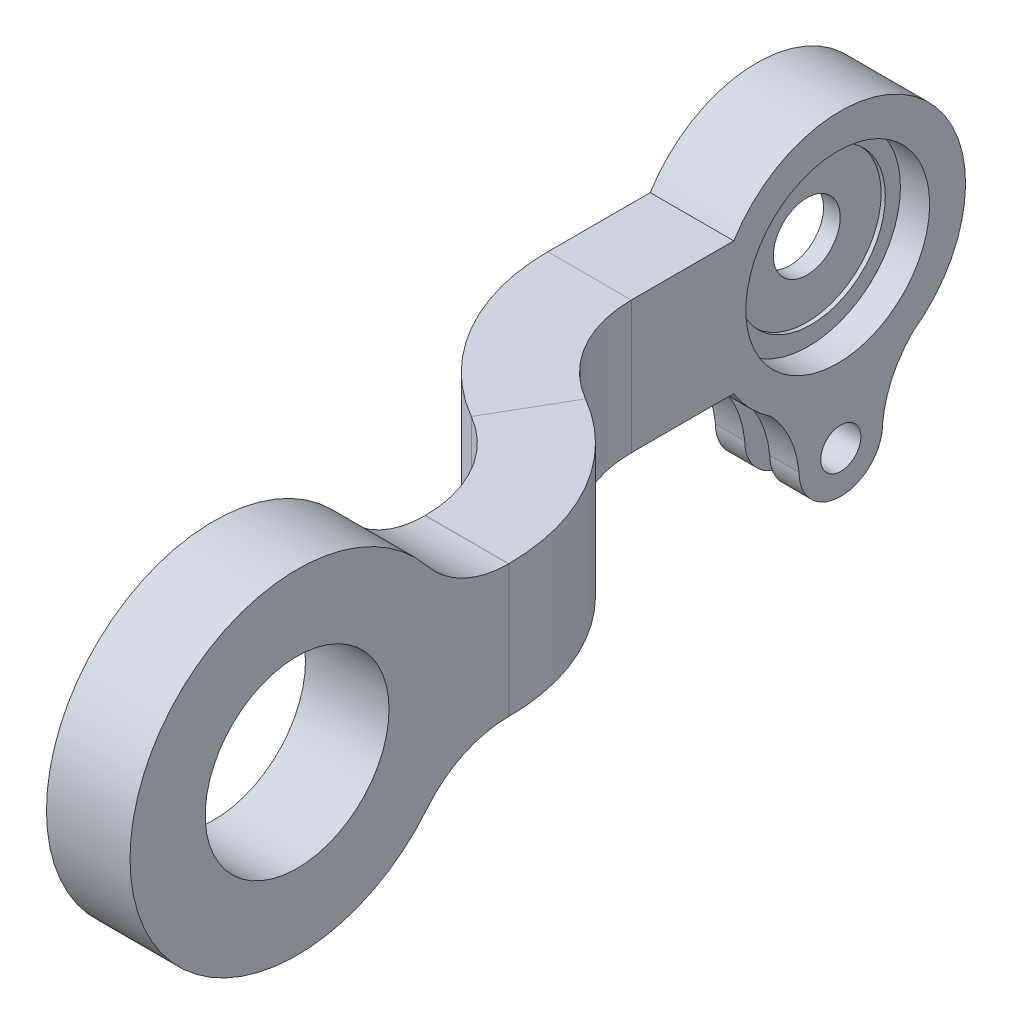
ISO-10303-21;
HEADER;
FILE_DESCRIPTION(('STEP AP214'),'2;1');
FILE_NAME('part.step','',(''),(''),'','','');
FILE_SCHEMA(('AUTOMOTIVE_DESIGN { 1 0 10303 214 1 1 1 1 }'));
ENDSEC;
DATA;
#1=APPLICATION_CONTEXT('core data for automotive mechanical design processes');
#2=APPLICATION_PROTOCOL_DEFINITION('international standard','automotive_design',2000,#1);
#3=PRODUCT_CONTEXT('',#1,'mechanical');
#4=PRODUCT('Part','Part','',(#3));
#5=PRODUCT_RELATED_PRODUCT_CATEGORY('part','',(#4));
#6=PRODUCT_DEFINITION_FORMATION('','',#4);
#7=PRODUCT_DEFINITION_CONTEXT('part definition',#1,'design');
#8=PRODUCT_DEFINITION('design','',#6,#7);
#9=PRODUCT_DEFINITION_SHAPE('','',#8);
#10=(LENGTH_UNIT() NAMED_UNIT(*) SI_UNIT(.MILLI.,.METRE.));
#11=(NAMED_UNIT(*) PLANE_ANGLE_UNIT() SI_UNIT($,.RADIAN.));
#12=(NAMED_UNIT(*) SI_UNIT($,.STERADIAN.) SOLID_ANGLE_UNIT());
#13=UNCERTAINTY_MEASURE_WITH_UNIT(LENGTH_MEASURE(1.E-05),#10,'distance_accuracy_value','');
#14=(GEOMETRIC_REPRESENTATION_CONTEXT(3) GLOBAL_UNCERTAINTY_ASSIGNED_CONTEXT((#13)) GLOBAL_UNIT_ASSIGNED_CONTEXT((#10,
#11,#12)) REPRESENTATION_CONTEXT('',''));
#15=CARTESIAN_POINT('',(0.,0.,0.));
#16=DIRECTION('',(0.,0.,1.));
#17=DIRECTION('',(1.,0.,0.));
#18=AXIS2_PLACEMENT_3D('',#15,#16,#17);
#19=CARTESIAN_POINT('',(-21.,0.,-85.));
#20=DIRECTION('',(-1.,0.,0.));
#21=DIRECTION('',(0.,0.,1.));
#22=AXIS2_PLACEMENT_3D('',#19,#20,#21);
#23=PLANE('',#22);
#24=CARTESIAN_POINT('',(-21.,0.,-85.));
#25=DIRECTION('',(-1.,0.,0.));
#26=DIRECTION('',(0.,0.,1.));
#27=AXIS2_PLACEMENT_3D('',#24,#25,#26);
#28=CIRCLE('',#27,4.00000000000001);
#29=CARTESIAN_POINT('',(-21.,0.,-81.));
#30=VERTEX_POINT('',#29);
#31=EDGE_CURVE('E403',#30,#30,#28,.T.);
#32=ORIENTED_EDGE('',*,*,#31,.F.);
#33=EDGE_LOOP('',(#32));
#34=FACE_BOUND('',#33,.T.);
#35=CARTESIAN_POINT('',(-21.,0.,-85.));
#36=DIRECTION('',(-1.,0.,0.));
#37=DIRECTION('',(0.,0.,1.));
#38=AXIS2_PLACEMENT_3D('',#35,#36,#37);
#39=CIRCLE('',#38,8.9);
#40=CARTESIAN_POINT('',(-21.,0.,-76.1));
#41=VERTEX_POINT('',#40);
#42=EDGE_CURVE('E11',#41,#41,#39,.F.);
#43=ORIENTED_EDGE('',*,*,#42,.F.);
#44=EDGE_LOOP('',(#43));
#45=FACE_BOUND('',#44,.T.);
#46=ADVANCED_FACE('F39',(#34,#45),#23,.T.);
#47=CARTESIAN_POINT('',(-19.,0.,-84.704611937866));
#48=DIRECTION('',(1.,0.,0.));
#49=DIRECTION('',(0.,0.,-1.));
#50=AXIS2_PLACEMENT_3D('',#47,#48,#49);
#51=PLANE('',#50);
#52=CARTESIAN_POINT('',(-19.,0.,-85.));
#53=DIRECTION('',(1.,0.,0.));
#54=DIRECTION('',(0.,0.,-1.));
#55=AXIS2_PLACEMENT_3D('',#52,#53,#54);
#56=CIRCLE('',#55,4.00000000000001);
#57=CARTESIAN_POINT('',(-19.,0.,-89.));
#58=VERTEX_POINT('',#57);
#59=EDGE_CURVE('E407',#58,#58,#56,.F.);
#60=ORIENTED_EDGE('',*,*,#59,.T.);
#61=EDGE_LOOP('',(#60));
#62=FACE_BOUND('',#61,.T.);
#63=CARTESIAN_POINT('',(-19.,0.,-85.));
#64=DIRECTION('',(1.,0.,0.));
#65=DIRECTION('',(0.,0.,-1.));
#66=AXIS2_PLACEMENT_3D('',#63,#64,#65);
#67=CIRCLE('',#66,8.9);
#68=CARTESIAN_POINT('',(-19.,0.,-93.9));
#69=VERTEX_POINT('',#68);
#70=EDGE_CURVE('E47',#69,#69,#67,.F.);
#71=ORIENTED_EDGE('',*,*,#70,.F.);
#72=EDGE_LOOP('',(#71));
#73=FACE_BOUND('',#72,.T.);
#74=ADVANCED_FACE('F419',(#62,#73),#51,.T.);
#75=CARTESIAN_POINT('',(-23.,0.,-85.));
#76=DIRECTION('',(1.,0.,0.));
#77=DIRECTION('',(0.,0.,-1.));
#78=AXIS2_PLACEMENT_3D('',#75,#76,#77);
#79=CYLINDRICAL_SURFACE('',#78,4.00000000000001);
#80=ORIENTED_EDGE('',*,*,#31,.T.);
#81=EDGE_LOOP('',(#80));
#82=FACE_BOUND('',#81,.T.);
#83=ORIENTED_EDGE('',*,*,#59,.F.);
#84=EDGE_LOOP('',(#83));
#85=FACE_BOUND('',#84,.T.);
#86=ADVANCED_FACE('F421',(#82,#85),#79,.F.);
#87=CARTESIAN_POINT('',(-5.,20.4174516240623,-25.2859183969868));
#88=DIRECTION('',(1.,0.,0.));
#89=DIRECTION('',(0.,0.,-1.));
#90=AXIS2_PLACEMENT_3D('',#87,#88,#89);
#91=CYLINDRICAL_SURFACE('',#90,12.5);
#92=DIRECTION('',(1.,0.,0.));
#93=VECTOR('',#92,1.);
#94=CARTESIAN_POINT('',(-5.,12.5645856148076,-15.5605651673765));
#95=LINE('',#94,#93);
#96=CARTESIAN_POINT('',(5.,12.5645856148076,-15.5605651673765));
#97=VERTEX_POINT('',#96);
#98=CARTESIAN_POINT('',(-5.,12.5645856148076,-15.5605651673765));
#99=VERTEX_POINT('',#98);
#100=EDGE_CURVE('E396',#97,#99,#95,.F.);
#101=ORIENTED_EDGE('',*,*,#100,.F.);
#102=CARTESIAN_POINT('',(5.,20.4174516240623,-25.2859183969868));
#103=DIRECTION('',(1.,0.,0.));
#104=DIRECTION('',(0.,0.,-1.));
#105=AXIS2_PLACEMENT_3D('',#102,#103,#104);
#106=CIRCLE('',#105,12.5);
#107=CARTESIAN_POINT('',(5.,7.91745162406235,-25.2859183969868));
#108=VERTEX_POINT('',#107);
#109=EDGE_CURVE('E61',#97,#108,#106,.T.);
#110=ORIENTED_EDGE('',*,*,#109,.T.);
#111=DIRECTION('',(-1.,0.,0.));
#112=VECTOR('',#111,1.);
#113=CARTESIAN_POINT('',(-5.,7.91745162406235,-25.2859183969868));
#114=LINE('',#113,#112);
#115=CARTESIAN_POINT('',(-5.,7.91745162406235,-25.2859183969868));
#116=VERTEX_POINT('',#115);
#117=EDGE_CURVE('E399',#116,#108,#114,.F.);
#118=ORIENTED_EDGE('',*,*,#117,.F.);
#119=CARTESIAN_POINT('',(-5.,20.4174516240623,-25.2859183969868));
#120=DIRECTION('',(-1.,0.,0.));
#121=DIRECTION('',(0.,0.,1.));
#122=AXIS2_PLACEMENT_3D('',#119,#120,#121);
#123=CIRCLE('',#122,12.5);
#124=EDGE_CURVE('E54',#116,#99,#123,.T.);
#125=ORIENTED_EDGE('',*,*,#124,.T.);
#126=EDGE_LOOP('',(#101,#110,#118,#125));
#127=FACE_BOUND('',#126,.T.);
#128=ADVANCED_FACE('F41',(#127),#91,.F.);
#129=CARTESIAN_POINT('',(-5.,-20.4174516240623,-25.2859183969868));
#130=DIRECTION('',(1.,0.,0.));
#131=DIRECTION('',(0.,0.,-1.));
#132=AXIS2_PLACEMENT_3D('',#129,#130,#131);
#133=CYLINDRICAL_SURFACE('',#132,12.5);
#134=DIRECTION('',(1.,0.,0.));
#135=VECTOR('',#134,1.);
#136=CARTESIAN_POINT('',(-5.,-12.5645856148076,-15.5605651673765));
#137=LINE('',#136,#135);
#138=CARTESIAN_POINT('',(-5.,-12.5645856148076,-15.5605651673765));
#139=VERTEX_POINT('',#138);
#140=CARTESIAN_POINT('',(5.,-12.5645856148076,-15.5605651673765));
#141=VERTEX_POINT('',#140);
#142=EDGE_CURVE('E381',#139,#141,#137,.T.);
#143=ORIENTED_EDGE('',*,*,#142,.F.);
#144=CARTESIAN_POINT('',(-5.,-20.4174516240623,-25.2859183969868));
#145=DIRECTION('',(-1.,0.,0.));
#146=DIRECTION('',(0.,0.,1.));
#147=AXIS2_PLACEMENT_3D('',#144,#145,#146);
#148=CIRCLE('',#147,12.5);
#149=CARTESIAN_POINT('',(-5.,-7.91745162406235,-25.2859183969868));
#150=VERTEX_POINT('',#149);
#151=EDGE_CURVE('E391',#139,#150,#148,.T.);
#152=ORIENTED_EDGE('',*,*,#151,.T.);
#153=DIRECTION('',(-1.,0.,0.));
#154=VECTOR('',#153,1.);
#155=CARTESIAN_POINT('',(-5.,-7.91745162406235,-25.2859183969868));
#156=LINE('',#155,#154);
#157=CARTESIAN_POINT('',(5.,-7.91745162406235,-25.2859183969868));
#158=VERTEX_POINT('',#157);
#159=EDGE_CURVE('E388',#158,#150,#156,.T.);
#160=ORIENTED_EDGE('',*,*,#159,.F.);
#161=CARTESIAN_POINT('',(5.,-20.4174516240623,-25.2859183969868));
#162=DIRECTION('',(1.,0.,0.));
#163=DIRECTION('',(0.,0.,-1.));
#164=AXIS2_PLACEMENT_3D('',#161,#162,#163);
#165=CIRCLE('',#164,12.5);
#166=EDGE_CURVE('E393',#158,#141,#165,.T.);
#167=ORIENTED_EDGE('',*,*,#166,.T.);
#168=EDGE_LOOP('',(#143,#152,#160,#167));
#169=FACE_BOUND('',#168,.T.);
#170=ADVANCED_FACE('F553',(#169),#133,.F.);
#171=CARTESIAN_POINT('',(-25.,0.,-85.));
#172=DIRECTION('',(1.,0.,0.));
#173=DIRECTION('',(0.,0.,-1.));
#174=AXIS2_PLACEMENT_3D('',#171,#172,#173);
#175=CYLINDRICAL_SURFACE('',#174,15.);
#176=DIRECTION('',(-1.,0.,0.));
#177=VECTOR('',#176,1.);
#178=CARTESIAN_POINT('',(-21.5,-12.2408850503567,-93.6695290058891));
#179=LINE('',#178,#177);
#180=CARTESIAN_POINT('',(-25.,-12.2408850503567,-93.6695290058892));
#181=VERTEX_POINT('',#180);
#182=CARTESIAN_POINT('',(-21.5,-12.2408850503567,-93.6695290058891));
#183=VERTEX_POINT('',#182);
#184=EDGE_CURVE('E272',#181,#183,#179,.F.);
#185=ORIENTED_EDGE('',*,*,#184,.F.);
#186=CARTESIAN_POINT('',(-25.,0.,-85.));
#187=DIRECTION('',(1.,0.,0.));
#188=DIRECTION('',(0.,0.,-1.));
#189=AXIS2_PLACEMENT_3D('',#186,#187,#188);
#190=CIRCLE('',#189,15.);
#191=CARTESIAN_POINT('',(-25.,7.91745162406235,-72.2597504035191));
#192=VERTEX_POINT('',#191);
#193=EDGE_CURVE('E288',#181,#192,#190,.T.);
#194=ORIENTED_EDGE('',*,*,#193,.T.);
#195=DIRECTION('',(1.,0.,0.));
#196=VECTOR('',#195,1.);
#197=CARTESIAN_POINT('',(-25.,7.91745162406235,-72.2597504035191));
#198=LINE('',#197,#196);
#199=CARTESIAN_POINT('',(-15.,7.91745162406235,-72.2597504035191));
#200=VERTEX_POINT('',#199);
#201=EDGE_CURVE('E287',#192,#200,#198,.T.);
#202=ORIENTED_EDGE('',*,*,#201,.T.);
#203=CARTESIAN_POINT('',(-15.,0.,-85.));
#204=DIRECTION('',(1.,0.,0.));
#205=DIRECTION('',(0.,0.,-1.));
#206=AXIS2_PLACEMENT_3D('',#203,#204,#205);
#207=CIRCLE('',#206,15.);
#208=CARTESIAN_POINT('',(-15.,-12.2408850503567,-93.6695290058891));
#209=VERTEX_POINT('',#208);
#210=EDGE_CURVE('E283',#209,#200,#207,.T.);
#211=ORIENTED_EDGE('',*,*,#210,.F.);
#212=DIRECTION('',(1.,0.,0.));
#213=VECTOR('',#212,1.);
#214=CARTESIAN_POINT('',(-18.5,-12.2408850503567,-93.6695290058891));
#215=LINE('',#214,#213);
#216=CARTESIAN_POINT('',(-18.5,-12.2408850503567,-93.6695290058891));
#217=VERTEX_POINT('',#216);
#218=EDGE_CURVE('E477',#209,#217,#215,.F.);
#219=ORIENTED_EDGE('',*,*,#218,.T.);
#220=CARTESIAN_POINT('',(-18.5,0.,-85.));
#221=DIRECTION('',(1.,0.,0.));
#222=DIRECTION('',(0.,0.,-1.));
#223=AXIS2_PLACEMENT_3D('',#220,#221,#222);
#224=CIRCLE('',#223,15.);
#225=CARTESIAN_POINT('',(-18.5,-12.510308438301,-76.7239995904679));
#226=VERTEX_POINT('',#225);
#227=EDGE_CURVE('E379',#217,#226,#224,.F.);
#228=ORIENTED_EDGE('',*,*,#227,.T.);
#229=DIRECTION('',(1.,0.,0.));
#230=VECTOR('',#229,1.);
#231=CARTESIAN_POINT('',(-18.5,-12.510308438301,-76.7239995904679));
#232=LINE('',#231,#230);
#233=CARTESIAN_POINT('',(-15.,-12.510308438301,-76.7239995904679));
#234=VERTEX_POINT('',#233);
#235=EDGE_CURVE('E199',#226,#234,#232,.T.);
#236=ORIENTED_EDGE('',*,*,#235,.T.);
#237=CARTESIAN_POINT('',(-15.,-7.91745162406235,-72.2597504035191));
#238=VERTEX_POINT('',#237);
#239=EDGE_CURVE('E289',#238,#234,#207,.T.);
#240=ORIENTED_EDGE('',*,*,#239,.F.);
#241=DIRECTION('',(1.,0.,0.));
#242=VECTOR('',#241,1.);
#243=CARTESIAN_POINT('',(-25.,-7.91745162406235,-72.2597504035191));
#244=LINE('',#243,#242);
#245=CARTESIAN_POINT('',(-25.,-7.91745162406235,-72.2597504035191));
#246=VERTEX_POINT('',#245);
#247=EDGE_CURVE('E368',#238,#246,#244,.F.);
#248=ORIENTED_EDGE('',*,*,#247,.T.);
#249=CARTESIAN_POINT('',(-25.,-12.510308438301,-76.7239995904679));
#250=VERTEX_POINT('',#249);
#251=EDGE_CURVE('E285',#246,#250,#190,.T.);
#252=ORIENTED_EDGE('',*,*,#251,.T.);
#253=DIRECTION('',(-1.,0.,0.));
#254=VECTOR('',#253,1.);
#255=CARTESIAN_POINT('',(-21.5,-12.510308438301,-76.7239995904679));
#256=LINE('',#255,#254);
#257=CARTESIAN_POINT('',(-21.5,-12.510308438301,-76.7239995904679));
#258=VERTEX_POINT('',#257);
#259=EDGE_CURVE('E277',#258,#250,#256,.T.);
#260=ORIENTED_EDGE('',*,*,#259,.F.);
#261=CARTESIAN_POINT('',(-21.5,0.,-85.));
#262=DIRECTION('',(-1.,0.,0.));
#263=DIRECTION('',(0.,0.,1.));
#264=AXIS2_PLACEMENT_3D('',#261,#262,#263);
#265=CIRCLE('',#264,15.);
#266=EDGE_CURVE('E377',#258,#183,#265,.F.);
#267=ORIENTED_EDGE('',*,*,#266,.T.);
#268=EDGE_LOOP('',(#185,#194,#202,#211,#219,#228,#236,#240,#248,#252,#260,#267));
#269=FACE_BOUND('',#268,.T.);
#270=ADVANCED_FACE('F483',(#269),#175,.T.);
#271=CARTESIAN_POINT('',(-15.,-7.91745162406235,-85.));
#272=DIRECTION('',(1.,0.,0.));
#273=DIRECTION('',(0.,0.,-1.));
#274=AXIS2_PLACEMENT_3D('',#271,#272,#273);
#275=PLANE('',#274);
#276=CARTESIAN_POINT('',(-15.,0.,-84.704611937866));
#277=DIRECTION('',(1.,0.,0.));
#278=DIRECTION('',(0.,0.,-1.));
#279=AXIS2_PLACEMENT_3D('',#276,#277,#278);
#280=CIRCLE('',#279,11.);
#281=CARTESIAN_POINT('',(-15.,0.,-95.704611937866));
#282=VERTEX_POINT('',#281);
#283=EDGE_CURVE('E410',#282,#282,#280,.T.);
#284=ORIENTED_EDGE('',*,*,#283,.F.);
#285=EDGE_LOOP('',(#284));
#286=FACE_BOUND('',#285,.T.);
#287=CARTESIAN_POINT('',(-15.,-19.972615480825,-85.0684964390711));
#288=DIRECTION('',(-1.,0.,0.));
#289=DIRECTION('',(0.,0.,1.));
#290=AXIS2_PLACEMENT_3D('',#287,#288,#289);
#291=CIRCLE('',#290,2.4);
#292=CARTESIAN_POINT('',(-15.,-19.972615480825,-82.668496439071));
#293=VERTEX_POINT('',#292);
#294=EDGE_CURVE('E385',#293,#293,#291,.T.);
#295=ORIENTED_EDGE('',*,*,#294,.T.);
#296=EDGE_LOOP('',(#295));
#297=FACE_BOUND('',#296,.T.);
#298=CARTESIAN_POINT('',(-15.,-11.6439228128336,-94.2885274391543));
#299=CARTESIAN_POINT('',(-15.,-15.0282523884813,-90.5702618472204));
#300=CARTESIAN_POINT('',(-15.,-19.972615480825,-90.0684964390711));
#301=B_SPLINE_CURVE_WITH_KNOTS('',2,(#298,#299,#300),.UNSPECIFIED.,.F.,.F.,(3,3),(0.,1.),.UNSPECIFIED.);
#302=CARTESIAN_POINT('',(-15.,-19.972615480825,-90.068496439071));
#303=VERTEX_POINT('',#302);
#304=EDGE_CURVE('E200',#209,#303,#301,.T.);
#305=ORIENTED_EDGE('',*,*,#304,.F.);
#306=ORIENTED_EDGE('',*,*,#210,.T.);
#307=DIRECTION('',(0.,0.,1.));
#308=VECTOR('',#307,1.);
#309=CARTESIAN_POINT('',(-15.,7.91745162406235,-85.));
#310=LINE('',#309,#308);
#311=CARTESIAN_POINT('',(-15.,7.91745162406235,-60.));
#312=VERTEX_POINT('',#311);
#313=EDGE_CURVE('E298',#200,#312,#310,.T.);
#314=ORIENTED_EDGE('',*,*,#313,.T.);
#315=DIRECTION('',(0.,1.,0.));
#316=VECTOR('',#315,1.);
#317=CARTESIAN_POINT('',(-15.,-7.91745162406235,-60.));
#318=LINE('',#317,#316);
#319=CARTESIAN_POINT('',(-15.,-7.91745162406235,-60.));
#320=VERTEX_POINT('',#319);
#321=EDGE_CURVE('E295',#320,#312,#318,.T.);
#322=ORIENTED_EDGE('',*,*,#321,.F.);
#323=DIRECTION('',(0.,0.,1.));
#324=VECTOR('',#323,1.);
#325=CARTESIAN_POINT('',(-15.,-7.91745162406235,-85.));
#326=LINE('',#325,#324);
#327=EDGE_CURVE('E294',#238,#320,#326,.T.);
#328=ORIENTED_EDGE('',*,*,#327,.F.);
#329=ORIENTED_EDGE('',*,*,#239,.T.);
#330=CARTESIAN_POINT('',(-15.,-19.972615480825,-80.068496439071));
#331=CARTESIAN_POINT('',(-15.,-15.0282523884813,-79.5667310309217));
#332=CARTESIAN_POINT('',(-15.,-11.6439228128336,-75.8484654389878));
#333=B_SPLINE_CURVE_WITH_KNOTS('',2,(#330,#331,#332),.UNSPECIFIED.,.F.,.F.,(3,3),(0.,1.),.UNSPECIFIED.);
#334=CARTESIAN_POINT('',(-15.,-19.972615480825,-80.0684964390711));
#335=VERTEX_POINT('',#334);
#336=EDGE_CURVE('E461',#335,#234,#333,.T.);
#337=ORIENTED_EDGE('',*,*,#336,.F.);
#338=CARTESIAN_POINT('',(-15.,-19.972615480825,-85.0684964390711));
#339=DIRECTION('',(-1.,0.,0.));
#340=DIRECTION('',(0.,0.,-1.));
#341=AXIS2_PLACEMENT_3D('',#338,#339,#340);
#342=CIRCLE('',#341,4.99999999999999);
#343=EDGE_CURVE('E192',#303,#335,#342,.T.);
#344=ORIENTED_EDGE('',*,*,#343,.F.);
#345=EDGE_LOOP('',(#305,#306,#314,#322,#328,#329,#337,#344));
#346=FACE_BOUND('',#345,.T.);
#347=ADVANCED_FACE('F486',(#286,#297,#346),#275,.T.);
#348=CARTESIAN_POINT('',(-15.,7.91745162406235,-85.));
#349=DIRECTION('',(0.,1.,0.));
#350=DIRECTION('',(0.,0.,1.));
#351=AXIS2_PLACEMENT_3D('',#348,#349,#350);
#352=PLANE('',#351);
#353=ORIENTED_EDGE('',*,*,#201,.F.);
#354=DIRECTION('',(0.,0.,1.));
#355=VECTOR('',#354,1.);
#356=CARTESIAN_POINT('',(-25.,7.91745162406235,-85.));
#357=LINE('',#356,#355);
#358=CARTESIAN_POINT('',(-25.,7.91745162406235,-60.));
#359=VERTEX_POINT('',#358);
#360=EDGE_CURVE('E334',#192,#359,#357,.T.);
#361=ORIENTED_EDGE('',*,*,#360,.T.);
#362=DIRECTION('',(-1.,0.,0.));
#363=VECTOR('',#362,1.);
#364=CARTESIAN_POINT('',(-15.,7.91745162406235,-60.));
#365=LINE('',#364,#363);
#366=EDGE_CURVE('E300',#312,#359,#365,.T.);
#367=ORIENTED_EDGE('',*,*,#366,.F.);
#368=ORIENTED_EDGE('',*,*,#313,.F.);
#369=EDGE_LOOP('',(#353,#361,#367,#368));
#370=FACE_BOUND('',#369,.T.);
#371=ADVANCED_FACE('F513',(#370),#352,.T.);
#372=CARTESIAN_POINT('',(-25.,-7.91745162406235,-85.));
#373=DIRECTION('',(-1.,0.,0.));
#374=DIRECTION('',(0.,0.,1.));
#375=AXIS2_PLACEMENT_3D('',#372,#373,#374);
#376=PLANE('',#375);
#377=CARTESIAN_POINT('',(-25.,0.,-85.));
#378=DIRECTION('',(-1.,0.,0.));
#379=DIRECTION('',(0.,0.,1.));
#380=AXIS2_PLACEMENT_3D('',#377,#378,#379);
#381=CIRCLE('',#380,11.5);
#382=CARTESIAN_POINT('',(-25.,0.,-73.5));
#383=VERTEX_POINT('',#382);
#384=EDGE_CURVE('E406',#383,#383,#381,.T.);
#385=ORIENTED_EDGE('',*,*,#384,.F.);
#386=EDGE_LOOP('',(#385));
#387=FACE_BOUND('',#386,.T.);
#388=CARTESIAN_POINT('',(-25.,-19.972615480825,-85.0684964390711));
#389=DIRECTION('',(-1.,0.,0.));
#390=DIRECTION('',(0.,0.,1.));
#391=AXIS2_PLACEMENT_3D('',#388,#389,#390);
#392=CIRCLE('',#391,2.4);
#393=CARTESIAN_POINT('',(-25.,-19.972615480825,-82.668496439071));
#394=VERTEX_POINT('',#393);
#395=EDGE_CURVE('E900',#394,#394,#392,.T.);
#396=ORIENTED_EDGE('',*,*,#395,.F.);
#397=EDGE_LOOP('',(#396));
#398=FACE_BOUND('',#397,.T.);
#399=ORIENTED_EDGE('',*,*,#193,.F.);
#400=CARTESIAN_POINT('',(-25.,-11.6439228128336,-94.2885274391543));
#401=CARTESIAN_POINT('',(-25.,-15.0282523884813,-90.5702618472204));
#402=CARTESIAN_POINT('',(-25.,-19.972615480825,-90.0684964390711));
#403=B_SPLINE_CURVE_WITH_KNOTS('',2,(#400,#401,#402),.UNSPECIFIED.,.F.,.F.,(3,3),(0.,1.),.UNSPECIFIED.);
#404=CARTESIAN_POINT('',(-25.,-19.972615480825,-90.068496439071));
#405=VERTEX_POINT('',#404);
#406=EDGE_CURVE('E257',#181,#405,#403,.T.);
#407=ORIENTED_EDGE('',*,*,#406,.T.);
#408=CARTESIAN_POINT('',(-25.,-19.972615480825,-85.0684964390711));
#409=DIRECTION('',(-1.,0.,0.));
#410=DIRECTION('',(0.,0.,-1.));
#411=AXIS2_PLACEMENT_3D('',#408,#409,#410);
#412=CIRCLE('',#411,4.99999999999999);
#413=CARTESIAN_POINT('',(-25.,-19.972615480825,-80.0684964390711));
#414=VERTEX_POINT('',#413);
#415=EDGE_CURVE('E264',#405,#414,#412,.T.);
#416=ORIENTED_EDGE('',*,*,#415,.T.);
#417=CARTESIAN_POINT('',(-25.,-19.972615480825,-80.068496439071));
#418=CARTESIAN_POINT('',(-25.,-15.0282523884813,-79.5667310309217));
#419=CARTESIAN_POINT('',(-25.,-11.6439228128336,-75.8484654389878));
#420=B_SPLINE_CURVE_WITH_KNOTS('',2,(#417,#418,#419),.UNSPECIFIED.,.F.,.F.,(3,3),(0.,1.),.UNSPECIFIED.);
#421=EDGE_CURVE('E252',#414,#250,#420,.T.);
#422=ORIENTED_EDGE('',*,*,#421,.T.);
#423=ORIENTED_EDGE('',*,*,#251,.F.);
#424=DIRECTION('',(0.,0.,1.));
#425=VECTOR('',#424,1.);
#426=CARTESIAN_POINT('',(-25.,-7.91745162406235,-85.));
#427=LINE('',#426,#425);
#428=CARTESIAN_POINT('',(-25.,-7.91745162406235,-60.));
#429=VERTEX_POINT('',#428);
#430=EDGE_CURVE('E354',#246,#429,#427,.T.);
#431=ORIENTED_EDGE('',*,*,#430,.T.);
#432=DIRECTION('',(0.,-1.,0.));
#433=VECTOR('',#432,1.);
#434=CARTESIAN_POINT('',(-25.,-7.91745162406235,-60.));
#435=LINE('',#434,#433);
#436=EDGE_CURVE('E336',#359,#429,#435,.T.);
#437=ORIENTED_EDGE('',*,*,#436,.F.);
#438=ORIENTED_EDGE('',*,*,#360,.F.);
#439=EDGE_LOOP('',(#399,#407,#416,#422,#423,#431,#437,#438));
#440=FACE_BOUND('',#439,.T.);
#441=ADVANCED_FACE('F495',(#387,#398,#440),#376,.T.);
#442=CARTESIAN_POINT('',(-15.,-7.91745162406235,-85.));
#443=DIRECTION('',(0.,-1.,0.));
#444=DIRECTION('',(0.,0.,-1.));
#445=AXIS2_PLACEMENT_3D('',#442,#443,#444);
#446=PLANE('',#445);
#447=ORIENTED_EDGE('',*,*,#247,.F.);
#448=ORIENTED_EDGE('',*,*,#327,.T.);
#449=DIRECTION('',(1.,0.,0.));
#450=VECTOR('',#449,1.);
#451=CARTESIAN_POINT('',(-15.,-7.91745162406235,-60.));
#452=LINE('',#451,#450);
#453=EDGE_CURVE('E312',#429,#320,#452,.T.);
#454=ORIENTED_EDGE('',*,*,#453,.F.);
#455=ORIENTED_EDGE('',*,*,#430,.F.);
#456=EDGE_LOOP('',(#447,#448,#454,#455));
#457=FACE_BOUND('',#456,.T.);
#458=ADVANCED_FACE('F492',(#457),#446,.T.);
#459=CARTESIAN_POINT('',(0.,0.,-60.));
#460=DIRECTION('',(0.,1.,0.));
#461=DIRECTION('',(0.,0.,1.));
#462=AXIS2_PLACEMENT_3D('',#459,#460,#461);
#463=CYLINDRICAL_SURFACE('',#462,15.);
#464=CARTESIAN_POINT('',(0.,7.91745162406235,-60.));
#465=DIRECTION('',(0.,1.,0.));
#466=DIRECTION('',(-1.,0.,0.));
#467=AXIS2_PLACEMENT_3D('',#464,#465,#466);
#468=CIRCLE('',#467,15.);
#469=CARTESIAN_POINT('',(-7.50000000000001,7.91745162406235,-47.0096189432334));
#470=VERTEX_POINT('',#469);
#471=EDGE_CURVE('E305',#312,#470,#468,.T.);
#472=ORIENTED_EDGE('',*,*,#471,.T.);
#473=DIRECTION('',(0.,1.,0.));
#474=VECTOR('',#473,1.);
#475=CARTESIAN_POINT('',(-7.50000000000001,-7.91745162406235,-47.0096189432334));
#476=LINE('',#475,#474);
#477=CARTESIAN_POINT('',(-7.50000000000001,-7.91745162406235,-47.0096189432334));
#478=VERTEX_POINT('',#477);
#479=EDGE_CURVE('E302',#478,#470,#476,.T.);
#480=ORIENTED_EDGE('',*,*,#479,.F.);
#481=CARTESIAN_POINT('',(0.,-7.91745162406235,-60.));
#482=DIRECTION('',(0.,1.,0.));
#483=DIRECTION('',(-1.,0.,0.));
#484=AXIS2_PLACEMENT_3D('',#481,#482,#483);
#485=CIRCLE('',#484,15.);
#486=EDGE_CURVE('E306',#320,#478,#485,.T.);
#487=ORIENTED_EDGE('',*,*,#486,.F.);
#488=ORIENTED_EDGE('',*,*,#321,.T.);
#489=EDGE_LOOP('',(#472,#480,#487,#488));
#490=FACE_BOUND('',#489,.T.);
#491=ADVANCED_FACE('F522',(#490),#463,.F.);
#492=CARTESIAN_POINT('',(-15.,7.91745162406235,-60.));
#493=DIRECTION('',(0.,1.,0.));
#494=DIRECTION('',(0.,0.,1.));
#495=AXIS2_PLACEMENT_3D('',#492,#493,#494);
#496=PLANE('',#495);
#497=CARTESIAN_POINT('',(0.,7.91745162406235,-60.));
#498=DIRECTION('',(0.,1.,0.));
#499=DIRECTION('',(-1.,0.,0.));
#500=AXIS2_PLACEMENT_3D('',#497,#498,#499);
#501=CIRCLE('',#500,25.);
#502=CARTESIAN_POINT('',(-12.5,7.91745162406235,-38.349364905389));
#503=VERTEX_POINT('',#502);
#504=EDGE_CURVE('E339',#359,#503,#501,.T.);
#505=ORIENTED_EDGE('',*,*,#504,.T.);
#506=DIRECTION('',(-0.5,0.,0.866025403784438));
#507=VECTOR('',#506,1.);
#508=CARTESIAN_POINT('',(-7.50000000000001,7.91745162406235,-47.0096189432334));
#509=LINE('',#508,#507);
#510=EDGE_CURVE('E309',#470,#503,#509,.T.);
#511=ORIENTED_EDGE('',*,*,#510,.F.);
#512=ORIENTED_EDGE('',*,*,#471,.F.);
#513=ORIENTED_EDGE('',*,*,#366,.T.);
#514=EDGE_LOOP('',(#505,#511,#512,#513));
#515=FACE_BOUND('',#514,.T.);
#516=ADVANCED_FACE('F519',(#515),#496,.T.);
#517=CARTESIAN_POINT('',(0.,0.,-60.));
#518=DIRECTION('',(0.,1.,0.));
#519=DIRECTION('',(0.,0.,1.));
#520=AXIS2_PLACEMENT_3D('',#517,#518,#519);
#521=CYLINDRICAL_SURFACE('',#520,25.);
#522=CARTESIAN_POINT('',(0.,-7.91745162406235,-60.));
#523=DIRECTION('',(0.,1.,0.));
#524=DIRECTION('',(-1.,0.,0.));
#525=AXIS2_PLACEMENT_3D('',#522,#523,#524);
#526=CIRCLE('',#525,25.);
#527=CARTESIAN_POINT('',(-12.5,-7.91745162406235,-38.349364905389));
#528=VERTEX_POINT('',#527);
#529=EDGE_CURVE('E358',#429,#528,#526,.T.);
#530=ORIENTED_EDGE('',*,*,#529,.T.);
#531=DIRECTION('',(0.,-1.,0.));
#532=VECTOR('',#531,1.);
#533=CARTESIAN_POINT('',(-12.5,-7.91745162406235,-38.349364905389));
#534=LINE('',#533,#532);
#535=EDGE_CURVE('E342',#503,#528,#534,.T.);
#536=ORIENTED_EDGE('',*,*,#535,.F.);
#537=ORIENTED_EDGE('',*,*,#504,.F.);
#538=ORIENTED_EDGE('',*,*,#436,.T.);
#539=EDGE_LOOP('',(#530,#536,#537,#538));
#540=FACE_BOUND('',#539,.T.);
#541=ADVANCED_FACE('F528',(#540),#521,.T.);
#542=CARTESIAN_POINT('',(-15.,-7.91745162406235,-60.));
#543=DIRECTION('',(0.,-1.,0.));
#544=DIRECTION('',(0.,0.,-1.));
#545=AXIS2_PLACEMENT_3D('',#542,#543,#544);
#546=PLANE('',#545);
#547=DIRECTION('',(0.5,0.,-0.866025403784438));
#548=VECTOR('',#547,1.);
#549=CARTESIAN_POINT('',(-7.50000000000001,-7.91745162406235,-47.0096189432334));
#550=LINE('',#549,#548);
#551=EDGE_CURVE('E323',#528,#478,#550,.T.);
#552=ORIENTED_EDGE('',*,*,#551,.F.);
#553=ORIENTED_EDGE('',*,*,#529,.F.);
#554=ORIENTED_EDGE('',*,*,#453,.T.);
#555=ORIENTED_EDGE('',*,*,#486,.T.);
#556=EDGE_LOOP('',(#552,#553,#554,#555));
#557=FACE_BOUND('',#556,.T.);
#558=ADVANCED_FACE('F526',(#557),#546,.T.);
#559=CARTESIAN_POINT('',(-20.,0.,-25.3589838486225));
#560=DIRECTION('',(0.,-1.,0.));
#561=DIRECTION('',(0.,0.,-1.));
#562=AXIS2_PLACEMENT_3D('',#559,#560,#561);
#563=CYLINDRICAL_SURFACE('',#562,25.);
#564=CARTESIAN_POINT('',(-20.,7.91745162406235,-25.3589838486225));
#565=DIRECTION('',(0.,-1.,0.));
#566=DIRECTION('',(0.5,0.,-0.866025403784439));
#567=AXIS2_PLACEMENT_3D('',#564,#565,#566);
#568=CIRCLE('',#567,25.);
#569=CARTESIAN_POINT('',(4.99999999999999,7.91745162406235,-25.3589838486225));
#570=VERTEX_POINT('',#569);
#571=EDGE_CURVE('E316',#470,#570,#568,.T.);
#572=ORIENTED_EDGE('',*,*,#571,.T.);
#573=DIRECTION('',(0.,1.,0.));
#574=VECTOR('',#573,1.);
#575=CARTESIAN_POINT('',(5.,-7.91745162406235,-25.3589838486225));
#576=LINE('',#575,#574);
#577=CARTESIAN_POINT('',(4.99999999999999,-7.91745162406235,-25.3589838486225));
#578=VERTEX_POINT('',#577);
#579=EDGE_CURVE('E313',#578,#570,#576,.T.);
#580=ORIENTED_EDGE('',*,*,#579,.F.);
#581=CARTESIAN_POINT('',(-20.,-7.91745162406235,-25.3589838486225));
#582=DIRECTION('',(0.,-1.,0.));
#583=DIRECTION('',(0.5,0.,-0.866025403784439));
#584=AXIS2_PLACEMENT_3D('',#581,#582,#583);
#585=CIRCLE('',#584,25.);
#586=EDGE_CURVE('E317',#478,#578,#585,.T.);
#587=ORIENTED_EDGE('',*,*,#586,.F.);
#588=ORIENTED_EDGE('',*,*,#479,.T.);
#589=EDGE_LOOP('',(#572,#580,#587,#588));
#590=FACE_BOUND('',#589,.T.);
#591=ADVANCED_FACE('F542',(#590),#563,.T.);
#592=CARTESIAN_POINT('',(-7.50000000000001,7.91745162406235,-47.0096189432334));
#593=DIRECTION('',(0.,1.,0.));
#594=DIRECTION('',(0.,0.,1.));
#595=AXIS2_PLACEMENT_3D('',#592,#593,#594);
#596=PLANE('',#595);
#597=CARTESIAN_POINT('',(-20.,7.91745162406235,-25.3589838486225));
#598=DIRECTION('',(0.,-1.,0.));
#599=DIRECTION('',(0.5,0.,-0.866025403784439));
#600=AXIS2_PLACEMENT_3D('',#597,#598,#599);
#601=CIRCLE('',#600,15.);
#602=CARTESIAN_POINT('',(-5.,7.91745162406235,-25.3589838486225));
#603=VERTEX_POINT('',#602);
#604=EDGE_CURVE('E345',#503,#603,#601,.T.);
#605=ORIENTED_EDGE('',*,*,#604,.T.);
#606=DIRECTION('',(-1.,0.,0.));
#607=VECTOR('',#606,1.);
#608=CARTESIAN_POINT('',(5.,7.91745162406235,-25.3589838486225));
#609=LINE('',#608,#607);
#610=EDGE_CURVE('E320',#570,#603,#609,.T.);
#611=ORIENTED_EDGE('',*,*,#610,.F.);
#612=ORIENTED_EDGE('',*,*,#571,.F.);
#613=ORIENTED_EDGE('',*,*,#510,.T.);
#614=EDGE_LOOP('',(#605,#611,#612,#613));
#615=FACE_BOUND('',#614,.T.);
#616=ADVANCED_FACE('F534',(#615),#596,.T.);
#617=CARTESIAN_POINT('',(-20.,0.,-25.3589838486225));
#618=DIRECTION('',(0.,-1.,0.));
#619=DIRECTION('',(0.,0.,-1.));
#620=AXIS2_PLACEMENT_3D('',#617,#618,#619);
#621=CYLINDRICAL_SURFACE('',#620,15.);
#622=CARTESIAN_POINT('',(-20.,-7.91745162406235,-25.3589838486225));
#623=DIRECTION('',(0.,-1.,0.));
#624=DIRECTION('',(0.5,0.,-0.866025403784439));
#625=AXIS2_PLACEMENT_3D('',#622,#623,#624);
#626=CIRCLE('',#625,15.);
#627=CARTESIAN_POINT('',(-5.,-7.91745162406235,-25.3589838486225));
#628=VERTEX_POINT('',#627);
#629=EDGE_CURVE('E363',#528,#628,#626,.T.);
#630=ORIENTED_EDGE('',*,*,#629,.T.);
#631=DIRECTION('',(0.,-1.,0.));
#632=VECTOR('',#631,1.);
#633=CARTESIAN_POINT('',(-5.,-7.91745162406235,-25.3589838486225));
#634=LINE('',#633,#632);
#635=EDGE_CURVE('E348',#603,#628,#634,.T.);
#636=ORIENTED_EDGE('',*,*,#635,.F.);
#637=ORIENTED_EDGE('',*,*,#604,.F.);
#638=ORIENTED_EDGE('',*,*,#535,.T.);
#639=EDGE_LOOP('',(#630,#636,#637,#638));
#640=FACE_BOUND('',#639,.T.);
#641=ADVANCED_FACE('F530',(#640),#621,.F.);
#642=CARTESIAN_POINT('',(-7.50000000000001,-7.91745162406235,-47.0096189432334));
#643=DIRECTION('',(0.,-1.,0.));
#644=DIRECTION('',(0.,0.,-1.));
#645=AXIS2_PLACEMENT_3D('',#642,#643,#644);
#646=PLANE('',#645);
#647=DIRECTION('',(1.,0.,0.));
#648=VECTOR('',#647,1.);
#649=CARTESIAN_POINT('',(5.,-7.91745162406235,-25.3589838486225));
#650=LINE('',#649,#648);
#651=EDGE_CURVE('E331',#628,#578,#650,.T.);
#652=ORIENTED_EDGE('',*,*,#651,.F.);
#653=ORIENTED_EDGE('',*,*,#629,.F.);
#654=ORIENTED_EDGE('',*,*,#551,.T.);
#655=ORIENTED_EDGE('',*,*,#586,.T.);
#656=EDGE_LOOP('',(#652,#653,#654,#655));
#657=FACE_BOUND('',#656,.T.);
#658=ADVANCED_FACE('F545',(#657),#646,.T.);
#659=CARTESIAN_POINT('',(5.,-7.91745162406235,-25.3589838486225));
#660=DIRECTION('',(1.,0.,0.));
#661=DIRECTION('',(0.,0.,-1.));
#662=AXIS2_PLACEMENT_3D('',#659,#660,#661);
#663=PLANE('',#662);
#664=ORIENTED_EDGE('',*,*,#109,.F.);
#665=CARTESIAN_POINT('',(5.,0.,0.));
#666=DIRECTION('',(1.,0.,0.));
#667=DIRECTION('',(0.,0.,-1.));
#668=AXIS2_PLACEMENT_3D('',#665,#666,#667);
#669=CIRCLE('',#668,20.);
#670=EDGE_CURVE('E280',#97,#141,#669,.T.);
#671=ORIENTED_EDGE('',*,*,#670,.T.);
#672=ORIENTED_EDGE('',*,*,#166,.F.);
#673=DIRECTION('',(0.,0.,1.));
#674=VECTOR('',#673,1.);
#675=CARTESIAN_POINT('',(5.,-7.91745162406235,-25.3589838486225));
#676=LINE('',#675,#674);
#677=EDGE_CURVE('E328',#578,#158,#676,.T.);
#678=ORIENTED_EDGE('',*,*,#677,.F.);
#679=ORIENTED_EDGE('',*,*,#579,.T.);
#680=DIRECTION('',(0.,0.,1.));
#681=VECTOR('',#680,1.);
#682=CARTESIAN_POINT('',(5.,7.91745162406235,-25.3589838486225));
#683=LINE('',#682,#681);
#684=EDGE_CURVE('E324',#570,#108,#683,.T.);
#685=ORIENTED_EDGE('',*,*,#684,.T.);
#686=EDGE_LOOP('',(#664,#671,#672,#678,#679,#685));
#687=FACE_BOUND('',#686,.T.);
#688=CARTESIAN_POINT('',(5.,0.,0.));
#689=DIRECTION('',(1.,0.,0.));
#690=DIRECTION('',(0.,0.,-1.));
#691=AXIS2_PLACEMENT_3D('',#688,#689,#690);
#692=CIRCLE('',#691,11.);
#693=CARTESIAN_POINT('',(5.,0.,-11.));
#694=VERTEX_POINT('',#693);
#695=EDGE_CURVE('E896',#694,#694,#692,.T.);
#696=ORIENTED_EDGE('',*,*,#695,.F.);
#697=EDGE_LOOP('',(#696));
#698=FACE_BOUND('',#697,.T.);
#699=ADVANCED_FACE('F538',(#687,#698),#663,.T.);
#700=CARTESIAN_POINT('',(5.,7.91745162406235,-25.3589838486225));
#701=DIRECTION('',(0.,1.,0.));
#702=DIRECTION('',(0.,0.,1.));
#703=AXIS2_PLACEMENT_3D('',#700,#701,#702);
#704=PLANE('',#703);
#705=DIRECTION('',(0.,0.,1.));
#706=VECTOR('',#705,1.);
#707=CARTESIAN_POINT('',(-5.,7.91745162406235,-25.3589838486225));
#708=LINE('',#707,#706);
#709=EDGE_CURVE('E327',#603,#116,#708,.T.);
#710=ORIENTED_EDGE('',*,*,#709,.T.);
#711=ORIENTED_EDGE('',*,*,#117,.T.);
#712=ORIENTED_EDGE('',*,*,#684,.F.);
#713=ORIENTED_EDGE('',*,*,#610,.T.);
#714=EDGE_LOOP('',(#710,#711,#712,#713));
#715=FACE_BOUND('',#714,.T.);
#716=ADVANCED_FACE('F536',(#715),#704,.T.);
#717=CARTESIAN_POINT('',(-5.,-7.91745162406235,-25.3589838486225));
#718=DIRECTION('',(-1.,0.,0.));
#719=DIRECTION('',(0.,0.,1.));
#720=AXIS2_PLACEMENT_3D('',#717,#718,#719);
#721=PLANE('',#720);
#722=CARTESIAN_POINT('',(-5.,0.,0.));
#723=DIRECTION('',(1.,0.,0.));
#724=DIRECTION('',(0.,0.,-1.));
#725=AXIS2_PLACEMENT_3D('',#722,#723,#724);
#726=CIRCLE('',#725,11.);
#727=CARTESIAN_POINT('',(-5.,0.,-11.));
#728=VERTEX_POINT('',#727);
#729=EDGE_CURVE('E897',#728,#728,#726,.T.);
#730=ORIENTED_EDGE('',*,*,#729,.T.);
#731=EDGE_LOOP('',(#730));
#732=FACE_BOUND('',#731,.T.);
#733=CARTESIAN_POINT('',(-5.,0.,0.));
#734=DIRECTION('',(1.,0.,0.));
#735=DIRECTION('',(0.,0.,-1.));
#736=AXIS2_PLACEMENT_3D('',#733,#734,#735);
#737=CIRCLE('',#736,20.);
#738=EDGE_CURVE('E281',#99,#139,#737,.T.);
#739=ORIENTED_EDGE('',*,*,#738,.F.);
#740=ORIENTED_EDGE('',*,*,#124,.F.);
#741=ORIENTED_EDGE('',*,*,#709,.F.);
#742=ORIENTED_EDGE('',*,*,#635,.T.);
#743=DIRECTION('',(0.,0.,1.));
#744=VECTOR('',#743,1.);
#745=CARTESIAN_POINT('',(-5.,-7.91745162406235,-25.3589838486225));
#746=LINE('',#745,#744);
#747=EDGE_CURVE('E351',#628,#150,#746,.T.);
#748=ORIENTED_EDGE('',*,*,#747,.T.);
#749=ORIENTED_EDGE('',*,*,#151,.F.);
#750=EDGE_LOOP('',(#739,#740,#741,#742,#748,#749));
#751=FACE_BOUND('',#750,.T.);
#752=ADVANCED_FACE('F550',(#732,#751),#721,.T.);
#753=CARTESIAN_POINT('',(5.,-7.91745162406235,-25.3589838486225));
#754=DIRECTION('',(0.,-1.,0.));
#755=DIRECTION('',(0.,0.,-1.));
#756=AXIS2_PLACEMENT_3D('',#753,#754,#755);
#757=PLANE('',#756);
#758=ORIENTED_EDGE('',*,*,#677,.T.);
#759=ORIENTED_EDGE('',*,*,#159,.T.);
#760=ORIENTED_EDGE('',*,*,#747,.F.);
#761=ORIENTED_EDGE('',*,*,#651,.T.);
#762=EDGE_LOOP('',(#758,#759,#760,#761));
#763=FACE_BOUND('',#762,.T.);
#764=ADVANCED_FACE('F547',(#763),#757,.T.);
#765=CARTESIAN_POINT('',(-5.,0.,0.));
#766=DIRECTION('',(1.,0.,0.));
#767=DIRECTION('',(0.,0.,-1.));
#768=AXIS2_PLACEMENT_3D('',#765,#766,#767);
#769=CYLINDRICAL_SURFACE('',#768,20.);
#770=ORIENTED_EDGE('',*,*,#670,.F.);
#771=ORIENTED_EDGE('',*,*,#100,.T.);
#772=ORIENTED_EDGE('',*,*,#738,.T.);
#773=ORIENTED_EDGE('',*,*,#142,.T.);
#774=EDGE_LOOP('',(#770,#771,#772,#773));
#775=FACE_BOUND('',#774,.T.);
#776=ADVANCED_FACE('F556',(#775),#769,.T.);
#777=CARTESIAN_POINT('',(-21.5,-19.972615480825,-80.068496439071));
#778=CARTESIAN_POINT('',(-21.5,-15.0282523884813,-79.5667310309217));
#779=CARTESIAN_POINT('',(-21.5,-11.6439228128336,-75.8484654389878));
#780=B_SPLINE_CURVE_WITH_KNOTS('',2,(#777,#778,#779),.UNSPECIFIED.,.F.,.F.,(3,3),(0.,1.),.UNSPECIFIED.);
#781=DIRECTION('',(-1.,0.,0.));
#782=VECTOR('',#781,1.);
#783=SURFACE_OF_LINEAR_EXTRUSION('',#780,#782);
#784=CARTESIAN_POINT('',(-21.5,-19.972615480825,-80.0684964390711));
#785=VERTEX_POINT('',#784);
#786=EDGE_CURVE('E241',#785,#258,#780,.T.);
#787=ORIENTED_EDGE('',*,*,#786,.T.);
#788=ORIENTED_EDGE('',*,*,#259,.T.);
#789=ORIENTED_EDGE('',*,*,#421,.F.);
#790=DIRECTION('',(-1.,0.,0.));
#791=VECTOR('',#790,1.);
#792=CARTESIAN_POINT('',(-21.5,-19.972615480825,-80.0684964390711));
#793=LINE('',#792,#791);
#794=EDGE_CURVE('E270',#785,#414,#793,.T.);
#795=ORIENTED_EDGE('',*,*,#794,.F.);
#796=EDGE_LOOP('',(#787,#788,#789,#795));
#797=FACE_BOUND('',#796,.T.);
#798=ADVANCED_FACE('F227',(#797),#783,.T.);
#799=CARTESIAN_POINT('',(-21.5,-19.972615480825,-85.0684964390711));
#800=DIRECTION('',(-1.,0.,0.));
#801=DIRECTION('',(0.,0.,1.));
#802=AXIS2_PLACEMENT_3D('',#799,#800,#801);
#803=CYLINDRICAL_SURFACE('',#802,4.99999999999999);
#804=ORIENTED_EDGE('',*,*,#415,.F.);
#805=DIRECTION('',(-1.,0.,0.));
#806=VECTOR('',#805,1.);
#807=CARTESIAN_POINT('',(-21.5,-19.972615480825,-90.068496439071));
#808=LINE('',#807,#806);
#809=CARTESIAN_POINT('',(-21.5,-19.972615480825,-90.068496439071));
#810=VERTEX_POINT('',#809);
#811=EDGE_CURVE('E251',#810,#405,#808,.T.);
#812=ORIENTED_EDGE('',*,*,#811,.F.);
#813=CARTESIAN_POINT('',(-21.5,-19.972615480825,-85.0684964390711));
#814=DIRECTION('',(-1.,0.,0.));
#815=DIRECTION('',(0.,0.,-1.));
#816=AXIS2_PLACEMENT_3D('',#813,#814,#815);
#817=CIRCLE('',#816,4.99999999999999);
#818=EDGE_CURVE('E240',#810,#785,#817,.T.);
#819=ORIENTED_EDGE('',*,*,#818,.T.);
#820=ORIENTED_EDGE('',*,*,#794,.T.);
#821=EDGE_LOOP('',(#804,#812,#819,#820));
#822=FACE_BOUND('',#821,.T.);
#823=ADVANCED_FACE('F224',(#822),#803,.T.);
#824=CARTESIAN_POINT('',(-21.5,-11.6439228128336,-94.2885274391543));
#825=CARTESIAN_POINT('',(-21.5,-15.0282523884813,-90.5702618472204));
#826=CARTESIAN_POINT('',(-21.5,-19.972615480825,-90.0684964390711));
#827=B_SPLINE_CURVE_WITH_KNOTS('',2,(#824,#825,#826),.UNSPECIFIED.,.F.,.F.,(3,3),(0.,1.),.UNSPECIFIED.);
#828=DIRECTION('',(-1.,0.,0.));
#829=VECTOR('',#828,1.);
#830=SURFACE_OF_LINEAR_EXTRUSION('',#827,#829);
#831=ORIENTED_EDGE('',*,*,#406,.F.);
#832=ORIENTED_EDGE('',*,*,#184,.T.);
#833=EDGE_CURVE('E235',#183,#810,#827,.T.);
#834=ORIENTED_EDGE('',*,*,#833,.T.);
#835=ORIENTED_EDGE('',*,*,#811,.T.);
#836=EDGE_LOOP('',(#831,#832,#834,#835));
#837=FACE_BOUND('',#836,.T.);
#838=ADVANCED_FACE('F222',(#837),#830,.T.);
#839=CARTESIAN_POINT('',(-21.5,-15.4182607676553,-78.7626059849756));
#840=DIRECTION('',(-1.,0.,0.));
#841=DIRECTION('',(0.,0.,-1.));
#842=AXIS2_PLACEMENT_3D('',#839,#840,#841);
#843=PLANE('',#842);
#844=CARTESIAN_POINT('',(-21.5,-19.972615480825,-85.0684964390711));
#845=DIRECTION('',(-1.,0.,0.));
#846=DIRECTION('',(0.,0.,1.));
#847=AXIS2_PLACEMENT_3D('',#844,#845,#846);
#848=CIRCLE('',#847,2.4);
#849=CARTESIAN_POINT('',(-21.5,-19.972615480825,-82.668496439071));
#850=VERTEX_POINT('',#849);
#851=EDGE_CURVE('E207',#850,#850,#848,.T.);
#852=ORIENTED_EDGE('',*,*,#851,.T.);
#853=EDGE_LOOP('',(#852));
#854=FACE_BOUND('',#853,.T.);
#855=ORIENTED_EDGE('',*,*,#266,.F.);
#856=ORIENTED_EDGE('',*,*,#786,.F.);
#857=ORIENTED_EDGE('',*,*,#818,.F.);
#858=ORIENTED_EDGE('',*,*,#833,.F.);
#859=EDGE_LOOP('',(#855,#856,#857,#858));
#860=FACE_BOUND('',#859,.T.);
#861=ADVANCED_FACE('F218',(#854,#860),#843,.F.);
#862=CARTESIAN_POINT('',(-18.5,-19.972615480825,-80.068496439071));
#863=CARTESIAN_POINT('',(-18.5,-15.0282523884813,-79.5667310309217));
#864=CARTESIAN_POINT('',(-18.5,-11.6439228128336,-75.8484654389878));
#865=B_SPLINE_CURVE_WITH_KNOTS('',2,(#862,#863,#864),.UNSPECIFIED.,.F.,.F.,(3,3),(0.,1.),.UNSPECIFIED.);
#866=DIRECTION('',(1.,0.,0.));
#867=VECTOR('',#866,1.);
#868=SURFACE_OF_LINEAR_EXTRUSION('',#865,#867);
#869=ORIENTED_EDGE('',*,*,#235,.F.);
#870=CARTESIAN_POINT('',(-18.5,-19.972615480825,-80.0684964390711));
#871=VERTEX_POINT('',#870);
#872=EDGE_CURVE('E180',#871,#226,#865,.T.);
#873=ORIENTED_EDGE('',*,*,#872,.F.);
#874=DIRECTION('',(1.,0.,0.));
#875=VECTOR('',#874,1.);
#876=CARTESIAN_POINT('',(-18.5,-19.972615480825,-80.0684964390711));
#877=LINE('',#876,#875);
#878=EDGE_CURVE('E189',#871,#335,#877,.T.);
#879=ORIENTED_EDGE('',*,*,#878,.T.);
#880=ORIENTED_EDGE('',*,*,#336,.T.);
#881=EDGE_LOOP('',(#869,#873,#879,#880));
#882=FACE_BOUND('',#881,.T.);
#883=ADVANCED_FACE('F197',(#882),#868,.F.);
#884=CARTESIAN_POINT('',(-18.5,-11.6439228128336,-94.2885274391543));
#885=CARTESIAN_POINT('',(-18.5,-15.0282523884813,-90.5702618472204));
#886=CARTESIAN_POINT('',(-18.5,-19.972615480825,-90.0684964390711));
#887=B_SPLINE_CURVE_WITH_KNOTS('',2,(#884,#885,#886),.UNSPECIFIED.,.F.,.F.,(3,3),(0.,1.),.UNSPECIFIED.);
#888=DIRECTION('',(1.,0.,0.));
#889=VECTOR('',#888,1.);
#890=SURFACE_OF_LINEAR_EXTRUSION('',#887,#889);
#891=ORIENTED_EDGE('',*,*,#218,.F.);
#892=ORIENTED_EDGE('',*,*,#304,.T.);
#893=DIRECTION('',(1.,0.,0.));
#894=VECTOR('',#893,1.);
#895=CARTESIAN_POINT('',(-18.5,-19.972615480825,-90.068496439071));
#896=LINE('',#895,#894);
#897=CARTESIAN_POINT('',(-18.5,-19.972615480825,-90.068496439071));
#898=VERTEX_POINT('',#897);
#899=EDGE_CURVE('E195',#898,#303,#896,.T.);
#900=ORIENTED_EDGE('',*,*,#899,.F.);
#901=EDGE_CURVE('E183',#217,#898,#887,.T.);
#902=ORIENTED_EDGE('',*,*,#901,.F.);
#903=EDGE_LOOP('',(#891,#892,#900,#902));
#904=FACE_BOUND('',#903,.T.);
#905=ADVANCED_FACE('F217',(#904),#890,.F.);
#906=CARTESIAN_POINT('',(-18.5,-19.972615480825,-85.0684964390711));
#907=DIRECTION('',(1.,0.,0.));
#908=DIRECTION('',(0.,0.,-1.));
#909=AXIS2_PLACEMENT_3D('',#906,#907,#908);
#910=CYLINDRICAL_SURFACE('',#909,4.99999999999999);
#911=ORIENTED_EDGE('',*,*,#343,.T.);
#912=ORIENTED_EDGE('',*,*,#878,.F.);
#913=CARTESIAN_POINT('',(-18.5,-19.972615480825,-85.0684964390711));
#914=DIRECTION('',(-1.,0.,0.));
#915=DIRECTION('',(0.,0.,-1.));
#916=AXIS2_PLACEMENT_3D('',#913,#914,#915);
#917=CIRCLE('',#916,4.99999999999999);
#918=EDGE_CURVE('E176',#898,#871,#917,.T.);
#919=ORIENTED_EDGE('',*,*,#918,.F.);
#920=ORIENTED_EDGE('',*,*,#899,.T.);
#921=EDGE_LOOP('',(#911,#912,#919,#920));
#922=FACE_BOUND('',#921,.T.);
#923=ADVANCED_FACE('F190',(#922),#910,.T.);
#924=CARTESIAN_POINT('',(-18.5,-15.4182607676553,-78.7626059849756));
#925=DIRECTION('',(1.,0.,0.));
#926=DIRECTION('',(0.,0.,-1.));
#927=AXIS2_PLACEMENT_3D('',#924,#925,#926);
#928=PLANE('',#927);
#929=CARTESIAN_POINT('',(-18.5,-19.972615480825,-85.0684964390711));
#930=DIRECTION('',(1.,0.,0.));
#931=DIRECTION('',(0.,0.,-1.));
#932=AXIS2_PLACEMENT_3D('',#929,#930,#931);
#933=CIRCLE('',#932,2.4);
#934=CARTESIAN_POINT('',(-18.5,-19.972615480825,-87.468496439071));
#935=VERTEX_POINT('',#934);
#936=EDGE_CURVE('E382',#935,#935,#933,.T.);
#937=ORIENTED_EDGE('',*,*,#936,.T.);
#938=EDGE_LOOP('',(#937));
#939=FACE_BOUND('',#938,.T.);
#940=ORIENTED_EDGE('',*,*,#227,.F.);
#941=ORIENTED_EDGE('',*,*,#901,.T.);
#942=ORIENTED_EDGE('',*,*,#918,.T.);
#943=ORIENTED_EDGE('',*,*,#872,.T.);
#944=EDGE_LOOP('',(#940,#941,#942,#943));
#945=FACE_BOUND('',#944,.T.);
#946=ADVANCED_FACE('F178',(#939,#945),#928,.F.);
#947=CARTESIAN_POINT('',(-15.,-19.972615480825,-85.0684964390711));
#948=DIRECTION('',(-1.,0.,0.));
#949=DIRECTION('',(0.,0.,1.));
#950=AXIS2_PLACEMENT_3D('',#947,#948,#949);
#951=CYLINDRICAL_SURFACE('',#950,2.4);
#952=ORIENTED_EDGE('',*,*,#294,.F.);
#953=EDGE_LOOP('',(#952));
#954=FACE_BOUND('',#953,.T.);
#955=ORIENTED_EDGE('',*,*,#936,.F.);
#956=EDGE_LOOP('',(#955));
#957=FACE_BOUND('',#956,.T.);
#958=ADVANCED_FACE('F451',(#954,#957),#951,.F.);
#959=ORIENTED_EDGE('',*,*,#395,.T.);
#960=EDGE_LOOP('',(#959));
#961=FACE_BOUND('',#960,.T.);
#962=ORIENTED_EDGE('',*,*,#851,.F.);
#963=EDGE_LOOP('',(#962));
#964=FACE_BOUND('',#963,.T.);
#965=ADVANCED_FACE('F447',(#961,#964),#951,.F.);
#966=CARTESIAN_POINT('',(-5.,0.,0.));
#967=DIRECTION('',(1.,0.,0.));
#968=DIRECTION('',(0.,0.,-1.));
#969=AXIS2_PLACEMENT_3D('',#966,#967,#968);
#970=CYLINDRICAL_SURFACE('',#969,11.);
#971=ORIENTED_EDGE('',*,*,#729,.F.);
#972=EDGE_LOOP('',(#971));
#973=FACE_BOUND('',#972,.T.);
#974=ORIENTED_EDGE('',*,*,#695,.T.);
#975=EDGE_LOOP('',(#974));
#976=FACE_BOUND('',#975,.T.);
#977=ADVANCED_FACE('F443',(#973,#976),#970,.F.);
#978=CARTESIAN_POINT('',(-21.,0.,-85.));
#979=DIRECTION('',(-1.,0.,0.));
#980=DIRECTION('',(0.,0.,1.));
#981=AXIS2_PLACEMENT_3D('',#978,#979,#980);
#982=CYLINDRICAL_SURFACE('',#981,11.5);
#983=CARTESIAN_POINT('',(-21.5,0.,-85.));
#984=DIRECTION('',(-1.,0.,0.));
#985=DIRECTION('',(0.,0.,1.));
#986=AXIS2_PLACEMENT_3D('',#983,#984,#985);
#987=CIRCLE('',#986,11.5);
#988=CARTESIAN_POINT('',(-21.5,0.,-73.5));
#989=VERTEX_POINT('',#988);
#990=EDGE_CURVE('E885',#989,#989,#987,.T.);
#991=ORIENTED_EDGE('',*,*,#990,.F.);
#992=EDGE_LOOP('',(#991));
#993=FACE_BOUND('',#992,.T.);
#994=ORIENTED_EDGE('',*,*,#384,.T.);
#995=EDGE_LOOP('',(#994));
#996=FACE_BOUND('',#995,.T.);
#997=ADVANCED_FACE('F438',(#993,#996),#982,.F.);
#998=CARTESIAN_POINT('',(-19.,0.,-84.704611937866));
#999=DIRECTION('',(1.,0.,0.));
#1000=DIRECTION('',(0.,0.,-1.));
#1001=AXIS2_PLACEMENT_3D('',#998,#999,#1000);
#1002=CYLINDRICAL_SURFACE('',#1001,11.);
#1003=CARTESIAN_POINT('',(-18.5,0.,-84.704611937866));
#1004=DIRECTION('',(1.,0.,0.));
#1005=DIRECTION('',(0.,0.,-1.));
#1006=AXIS2_PLACEMENT_3D('',#1003,#1004,#1005);
#1007=CIRCLE('',#1006,11.);
#1008=CARTESIAN_POINT('',(-18.5,0.,-95.704611937866));
#1009=VERTEX_POINT('',#1008);
#1010=EDGE_CURVE('E411',#1009,#1009,#1007,.F.);
#1011=ORIENTED_EDGE('',*,*,#1010,.T.);
#1012=EDGE_LOOP('',(#1011));
#1013=FACE_BOUND('',#1012,.T.);
#1014=ORIENTED_EDGE('',*,*,#283,.T.);
#1015=EDGE_LOOP('',(#1014));
#1016=FACE_BOUND('',#1015,.T.);
#1017=ADVANCED_FACE('F436',(#1013,#1016),#1002,.F.);
#1018=CARTESIAN_POINT('',(-18.5,0.,-85.));
#1019=DIRECTION('',(1.,0.,0.));
#1020=DIRECTION('',(0.,0.,-1.));
#1021=AXIS2_PLACEMENT_3D('',#1018,#1019,#1020);
#1022=PLANE('',#1021);
#1023=CARTESIAN_POINT('',(-18.5,0.,-85.));
#1024=DIRECTION('',(1.,0.,0.));
#1025=DIRECTION('',(0.,0.,-1.));
#1026=AXIS2_PLACEMENT_3D('',#1023,#1024,#1025);
#1027=CIRCLE('',#1026,8.9);
#1028=CARTESIAN_POINT('',(-18.5,0.,-93.9));
#1029=VERTEX_POINT('',#1028);
#1030=EDGE_CURVE('E413',#1029,#1029,#1027,.T.);
#1031=ORIENTED_EDGE('',*,*,#1030,.F.);
#1032=EDGE_LOOP('',(#1031));
#1033=FACE_BOUND('',#1032,.T.);
#1034=ORIENTED_EDGE('',*,*,#1010,.F.);
#1035=EDGE_LOOP('',(#1034));
#1036=FACE_BOUND('',#1035,.T.);
#1037=ADVANCED_FACE('F434',(#1033,#1036),#1022,.T.);
#1038=CARTESIAN_POINT('',(-18.5,0.,-85.));
#1039=DIRECTION('',(-1.,0.,0.));
#1040=DIRECTION('',(0.,0.,1.));
#1041=AXIS2_PLACEMENT_3D('',#1038,#1039,#1040);
#1042=CYLINDRICAL_SURFACE('',#1041,8.9);
#1043=ORIENTED_EDGE('',*,*,#1030,.T.);
#1044=EDGE_LOOP('',(#1043));
#1045=FACE_BOUND('',#1044,.T.);
#1046=ORIENTED_EDGE('',*,*,#70,.T.);
#1047=EDGE_LOOP('',(#1046));
#1048=FACE_BOUND('',#1047,.T.);
#1049=ADVANCED_FACE('F417',(#1045,#1048),#1042,.F.);
#1050=CARTESIAN_POINT('',(-21.5,0.,-85.));
#1051=DIRECTION('',(-1.,0.,0.));
#1052=DIRECTION('',(0.,0.,1.));
#1053=AXIS2_PLACEMENT_3D('',#1050,#1051,#1052);
#1054=PLANE('',#1053);
#1055=ORIENTED_EDGE('',*,*,#990,.T.);
#1056=EDGE_LOOP('',(#1055));
#1057=FACE_BOUND('',#1056,.T.);
#1058=CARTESIAN_POINT('',(-21.5,0.,-85.));
#1059=DIRECTION('',(-1.,0.,0.));
#1060=DIRECTION('',(0.,0.,1.));
#1061=AXIS2_PLACEMENT_3D('',#1058,#1059,#1060);
#1062=CIRCLE('',#1061,8.9);
#1063=CARTESIAN_POINT('',(-21.5,0.,-76.1));
#1064=VERTEX_POINT('',#1063);
#1065=EDGE_CURVE('E881',#1064,#1064,#1062,.T.);
#1066=ORIENTED_EDGE('',*,*,#1065,.F.);
#1067=EDGE_LOOP('',(#1066));
#1068=FACE_BOUND('',#1067,.T.);
#1069=ADVANCED_FACE('F673',(#1057,#1068),#1054,.T.);
#1070=CARTESIAN_POINT('',(-21.5,0.,-85.));
#1071=DIRECTION('',(1.,0.,0.));
#1072=DIRECTION('',(0.,0.,-1.));
#1073=AXIS2_PLACEMENT_3D('',#1070,#1071,#1072);
#1074=CYLINDRICAL_SURFACE('',#1073,8.9);
#1075=ORIENTED_EDGE('',*,*,#1065,.T.);
#1076=EDGE_LOOP('',(#1075));
#1077=FACE_BOUND('',#1076,.T.);
#1078=ORIENTED_EDGE('',*,*,#42,.T.);
#1079=EDGE_LOOP('',(#1078));
#1080=FACE_BOUND('',#1079,.T.);
#1081=ADVANCED_FACE('F679',(#1077,#1080),#1074,.F.);
#1082=CLOSED_SHELL('',(#46,#74,#86,#128,#170,#270,#347,#371,#441,#458,#491,#516,#541,#558,#591,
#616,#641,#658,#699,#716,#752,#764,#776,#798,#823,#838,#861,#883,#905,#923,#946,#958,#965,#977,
#997,#1017,#1037,#1049,#1069,#1081));
#1083=MANIFOLD_SOLID_BREP('B2',#1082);
#1084=ADVANCED_BREP_SHAPE_REPRESENTATION('',(#18,#1083),#14);
#1085=SHAPE_DEFINITION_REPRESENTATION(#9,#1084);
ENDSEC;
END-ISO-10303-21;
